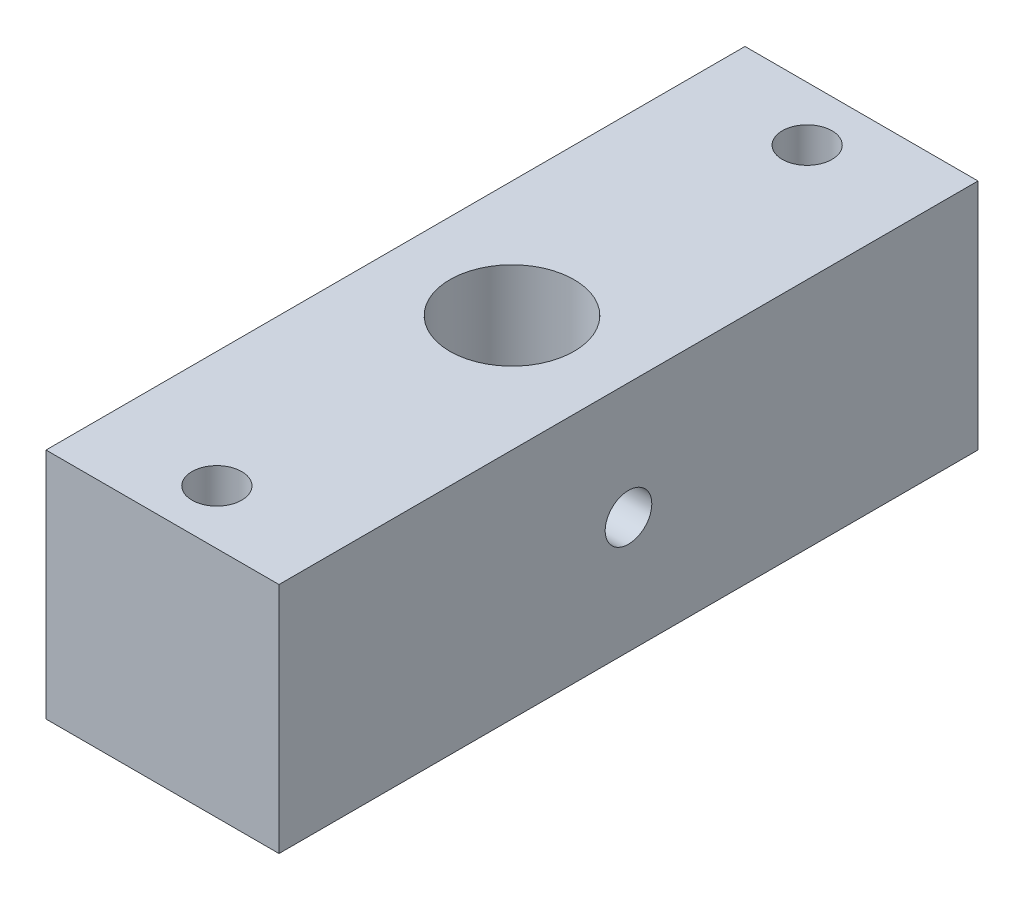
ISO-10303-21;
HEADER;
FILE_DESCRIPTION(('STEP AP214'),'2;1');
FILE_NAME('part.step','',(''),(''),'','','');
FILE_SCHEMA(('AUTOMOTIVE_DESIGN { 1 0 10303 214 1 1 1 1 }'));
ENDSEC;
DATA;
#1=APPLICATION_CONTEXT('core data for automotive mechanical design processes');
#2=APPLICATION_PROTOCOL_DEFINITION('international standard','automotive_design',2000,#1);
#3=PRODUCT_CONTEXT('',#1,'mechanical');
#4=PRODUCT('Part','Part','',(#3));
#5=PRODUCT_RELATED_PRODUCT_CATEGORY('part','',(#4));
#6=PRODUCT_DEFINITION_FORMATION('','',#4);
#7=PRODUCT_DEFINITION_CONTEXT('part definition',#1,'design');
#8=PRODUCT_DEFINITION('design','',#6,#7);
#9=PRODUCT_DEFINITION_SHAPE('','',#8);
#10=(LENGTH_UNIT() NAMED_UNIT(*) SI_UNIT(.MILLI.,.METRE.));
#11=(NAMED_UNIT(*) PLANE_ANGLE_UNIT() SI_UNIT($,.RADIAN.));
#12=(NAMED_UNIT(*) SI_UNIT($,.STERADIAN.) SOLID_ANGLE_UNIT());
#13=UNCERTAINTY_MEASURE_WITH_UNIT(LENGTH_MEASURE(1.E-05),#10,'distance_accuracy_value','');
#14=(GEOMETRIC_REPRESENTATION_CONTEXT(3) GLOBAL_UNCERTAINTY_ASSIGNED_CONTEXT((#13)) GLOBAL_UNIT_ASSIGNED_CONTEXT((#10,
#11,#12)) REPRESENTATION_CONTEXT('',''));
#15=CARTESIAN_POINT('',(0.,0.,0.));
#16=DIRECTION('',(0.,0.,1.));
#17=DIRECTION('',(1.,0.,0.));
#18=AXIS2_PLACEMENT_3D('',#15,#16,#17);
#19=CARTESIAN_POINT('',(0.,7.5,0.));
#20=DIRECTION('',(0.,1.,0.));
#21=DIRECTION('',(0.,0.,1.));
#22=AXIS2_PLACEMENT_3D('',#19,#20,#21);
#23=PLANE('',#22);
#24=CARTESIAN_POINT('',(0.,7.5,-19.));
#25=DIRECTION('',(0.,1.,0.));
#26=DIRECTION('',(0.,0.,1.));
#27=AXIS2_PLACEMENT_3D('',#24,#25,#26);
#28=CIRCLE('',#27,1.6);
#29=CARTESIAN_POINT('',(0.,7.5,-17.4));
#30=VERTEX_POINT('',#29);
#31=EDGE_CURVE('E192',#30,#30,#28,.T.);
#32=ORIENTED_EDGE('',*,*,#31,.F.);
#33=EDGE_LOOP('',(#32));
#34=FACE_BOUND('',#33,.T.);
#35=DIRECTION('',(0.,0.,-1.));
#36=VECTOR('',#35,1.);
#37=CARTESIAN_POINT('',(7.5,7.5,-22.5));
#38=LINE('',#37,#36);
#39=CARTESIAN_POINT('',(7.5,7.5,22.5));
#40=VERTEX_POINT('',#39);
#41=CARTESIAN_POINT('',(7.5,7.5,-22.5));
#42=VERTEX_POINT('',#41);
#43=EDGE_CURVE('E95',#40,#42,#38,.T.);
#44=ORIENTED_EDGE('',*,*,#43,.T.);
#45=DIRECTION('',(-1.,0.,0.));
#46=VECTOR('',#45,1.);
#47=CARTESIAN_POINT('',(-7.5,7.5,-22.5));
#48=LINE('',#47,#46);
#49=CARTESIAN_POINT('',(-7.5,7.5,-22.5));
#50=VERTEX_POINT('',#49);
#51=EDGE_CURVE('E90',#42,#50,#48,.T.);
#52=ORIENTED_EDGE('',*,*,#51,.T.);
#53=DIRECTION('',(0.,0.,1.));
#54=VECTOR('',#53,1.);
#55=CARTESIAN_POINT('',(-7.5,7.5,-22.5));
#56=LINE('',#55,#54);
#57=CARTESIAN_POINT('',(-7.5,7.5,22.5));
#58=VERTEX_POINT('',#57);
#59=EDGE_CURVE('E93',#50,#58,#56,.T.);
#60=ORIENTED_EDGE('',*,*,#59,.T.);
#61=DIRECTION('',(1.,0.,0.));
#62=VECTOR('',#61,1.);
#63=CARTESIAN_POINT('',(-7.5,7.5,22.5));
#64=LINE('',#63,#62);
#65=EDGE_CURVE('E60',#58,#40,#64,.T.);
#66=ORIENTED_EDGE('',*,*,#65,.T.);
#67=EDGE_LOOP('',(#44,#52,#60,#66));
#68=FACE_BOUND('',#67,.T.);
#69=CARTESIAN_POINT('',(0.,7.5,0.));
#70=DIRECTION('',(0.,1.,0.));
#71=DIRECTION('',(0.,0.,1.));
#72=AXIS2_PLACEMENT_3D('',#69,#70,#71);
#73=CIRCLE('',#72,4.);
#74=CARTESIAN_POINT('',(0.,7.5,4.));
#75=VERTEX_POINT('',#74);
#76=EDGE_CURVE('E111',#75,#75,#73,.T.);
#77=ORIENTED_EDGE('',*,*,#76,.F.);
#78=EDGE_LOOP('',(#77));
#79=FACE_BOUND('',#78,.T.);
#80=CARTESIAN_POINT('',(0.,7.5,19.));
#81=DIRECTION('',(0.,1.,0.));
#82=DIRECTION('',(0.,0.,-1.));
#83=AXIS2_PLACEMENT_3D('',#80,#81,#82);
#84=CIRCLE('',#83,1.6);
#85=CARTESIAN_POINT('',(0.,7.5,17.4));
#86=VERTEX_POINT('',#85);
#87=EDGE_CURVE('E185',#86,#86,#84,.T.);
#88=ORIENTED_EDGE('',*,*,#87,.F.);
#89=EDGE_LOOP('',(#88));
#90=FACE_BOUND('',#89,.T.);
#91=ADVANCED_FACE('F36',(#34,#68,#79,#90),#23,.T.);
#92=CARTESIAN_POINT('',(0.,-7.5,0.));
#93=DIRECTION('',(0.,1.,0.));
#94=DIRECTION('',(0.,0.,1.));
#95=AXIS2_PLACEMENT_3D('',#92,#93,#94);
#96=PLANE('',#95);
#97=DIRECTION('',(0.,0.,-1.));
#98=VECTOR('',#97,1.);
#99=CARTESIAN_POINT('',(7.5,-7.5,-22.5));
#100=LINE('',#99,#98);
#101=CARTESIAN_POINT('',(7.5,-7.5,22.5));
#102=VERTEX_POINT('',#101);
#103=CARTESIAN_POINT('',(7.5,-7.5,-22.5));
#104=VERTEX_POINT('',#103);
#105=EDGE_CURVE('E108',#102,#104,#100,.T.);
#106=ORIENTED_EDGE('',*,*,#105,.F.);
#107=DIRECTION('',(1.,0.,0.));
#108=VECTOR('',#107,1.);
#109=CARTESIAN_POINT('',(-7.5,-7.5,22.5));
#110=LINE('',#109,#108);
#111=CARTESIAN_POINT('',(-7.5,-7.5,22.5));
#112=VERTEX_POINT('',#111);
#113=EDGE_CURVE('E83',#112,#102,#110,.T.);
#114=ORIENTED_EDGE('',*,*,#113,.F.);
#115=DIRECTION('',(0.,0.,1.));
#116=VECTOR('',#115,1.);
#117=CARTESIAN_POINT('',(-7.5,-7.5,-22.5));
#118=LINE('',#117,#116);
#119=CARTESIAN_POINT('',(-7.5,-7.5,-22.5));
#120=VERTEX_POINT('',#119);
#121=EDGE_CURVE('E77',#120,#112,#118,.T.);
#122=ORIENTED_EDGE('',*,*,#121,.F.);
#123=DIRECTION('',(-1.,0.,0.));
#124=VECTOR('',#123,1.);
#125=CARTESIAN_POINT('',(-7.5,-7.5,-22.5));
#126=LINE('',#125,#124);
#127=EDGE_CURVE('E99',#104,#120,#126,.T.);
#128=ORIENTED_EDGE('',*,*,#127,.F.);
#129=EDGE_LOOP('',(#106,#114,#122,#128));
#130=FACE_BOUND('',#129,.T.);
#131=CARTESIAN_POINT('',(0.,-7.5,0.));
#132=DIRECTION('',(0.,1.,0.));
#133=DIRECTION('',(0.,0.,1.));
#134=AXIS2_PLACEMENT_3D('',#131,#132,#133);
#135=CIRCLE('',#134,4.);
#136=CARTESIAN_POINT('',(0.,-7.5,4.));
#137=VERTEX_POINT('',#136);
#138=EDGE_CURVE('E176',#137,#137,#135,.T.);
#139=ORIENTED_EDGE('',*,*,#138,.T.);
#140=EDGE_LOOP('',(#139));
#141=FACE_BOUND('',#140,.T.);
#142=CARTESIAN_POINT('',(0.,-7.5,-19.));
#143=DIRECTION('',(0.,1.,0.));
#144=DIRECTION('',(0.,0.,1.));
#145=AXIS2_PLACEMENT_3D('',#142,#143,#144);
#146=CIRCLE('',#145,1.6);
#147=CARTESIAN_POINT('',(0.,-7.5,-17.4));
#148=VERTEX_POINT('',#147);
#149=EDGE_CURVE('E180',#148,#148,#146,.T.);
#150=ORIENTED_EDGE('',*,*,#149,.T.);
#151=EDGE_LOOP('',(#150));
#152=FACE_BOUND('',#151,.T.);
#153=CARTESIAN_POINT('',(0.,-7.5,19.));
#154=DIRECTION('',(0.,1.,0.));
#155=DIRECTION('',(0.,0.,-1.));
#156=AXIS2_PLACEMENT_3D('',#153,#154,#155);
#157=CIRCLE('',#156,1.6);
#158=CARTESIAN_POINT('',(0.,-7.5,17.4));
#159=VERTEX_POINT('',#158);
#160=EDGE_CURVE('E183',#159,#159,#157,.T.);
#161=ORIENTED_EDGE('',*,*,#160,.T.);
#162=EDGE_LOOP('',(#161));
#163=FACE_BOUND('',#162,.T.);
#164=ADVANCED_FACE('F147',(#130,#141,#152,#163),#96,.F.);
#165=CARTESIAN_POINT('',(7.5,7.5,-22.5));
#166=DIRECTION('',(-1.,0.,0.));
#167=DIRECTION('',(0.,0.,1.));
#168=AXIS2_PLACEMENT_3D('',#165,#166,#167);
#169=PLANE('',#168);
#170=CARTESIAN_POINT('',(7.5,0.,0.));
#171=DIRECTION('',(1.,0.,0.));
#172=DIRECTION('',(0.,0.,-1.));
#173=AXIS2_PLACEMENT_3D('',#170,#171,#172);
#174=CIRCLE('',#173,1.5);
#175=CARTESIAN_POINT('',(7.5,0.,-1.5));
#176=VERTEX_POINT('',#175);
#177=EDGE_CURVE('E170',#176,#176,#174,.T.);
#178=ORIENTED_EDGE('',*,*,#177,.F.);
#179=EDGE_LOOP('',(#178));
#180=FACE_BOUND('',#179,.T.);
#181=ORIENTED_EDGE('',*,*,#105,.T.);
#182=DIRECTION('',(0.,-1.,0.));
#183=VECTOR('',#182,1.);
#184=CARTESIAN_POINT('',(7.5,7.5,-22.5));
#185=LINE('',#184,#183);
#186=EDGE_CURVE('E11',#42,#104,#185,.T.);
#187=ORIENTED_EDGE('',*,*,#186,.F.);
#188=ORIENTED_EDGE('',*,*,#43,.F.);
#189=DIRECTION('',(0.,-1.,0.));
#190=VECTOR('',#189,1.);
#191=CARTESIAN_POINT('',(7.5,7.5,22.5));
#192=LINE('',#191,#190);
#193=EDGE_CURVE('E104',#40,#102,#192,.T.);
#194=ORIENTED_EDGE('',*,*,#193,.T.);
#195=EDGE_LOOP('',(#181,#187,#188,#194));
#196=FACE_BOUND('',#195,.T.);
#197=ADVANCED_FACE('F38',(#180,#196),#169,.F.);
#198=CARTESIAN_POINT('',(-7.5,7.5,-22.5));
#199=DIRECTION('',(0.,0.,1.));
#200=DIRECTION('',(1.,0.,0.));
#201=AXIS2_PLACEMENT_3D('',#198,#199,#200);
#202=PLANE('',#201);
#203=ORIENTED_EDGE('',*,*,#127,.T.);
#204=DIRECTION('',(0.,-1.,0.));
#205=VECTOR('',#204,1.);
#206=CARTESIAN_POINT('',(-7.5,7.5,-22.5));
#207=LINE('',#206,#205);
#208=EDGE_CURVE('E51',#50,#120,#207,.T.);
#209=ORIENTED_EDGE('',*,*,#208,.F.);
#210=ORIENTED_EDGE('',*,*,#51,.F.);
#211=ORIENTED_EDGE('',*,*,#186,.T.);
#212=EDGE_LOOP('',(#203,#209,#210,#211));
#213=FACE_BOUND('',#212,.T.);
#214=ADVANCED_FACE('F98',(#213),#202,.F.);
#215=CARTESIAN_POINT('',(-7.5,7.5,-22.5));
#216=DIRECTION('',(1.,0.,0.));
#217=DIRECTION('',(0.,0.,-1.));
#218=AXIS2_PLACEMENT_3D('',#215,#216,#217);
#219=PLANE('',#218);
#220=CARTESIAN_POINT('',(-7.5,0.,0.));
#221=DIRECTION('',(1.,0.,0.));
#222=DIRECTION('',(0.,0.,-1.));
#223=AXIS2_PLACEMENT_3D('',#220,#221,#222);
#224=CIRCLE('',#223,1.5);
#225=CARTESIAN_POINT('',(-7.5,0.,-1.5));
#226=VERTEX_POINT('',#225);
#227=EDGE_CURVE('E121',#226,#226,#224,.T.);
#228=ORIENTED_EDGE('',*,*,#227,.T.);
#229=EDGE_LOOP('',(#228));
#230=FACE_BOUND('',#229,.T.);
#231=ORIENTED_EDGE('',*,*,#121,.T.);
#232=DIRECTION('',(0.,-1.,0.));
#233=VECTOR('',#232,1.);
#234=CARTESIAN_POINT('',(-7.5,7.5,22.5));
#235=LINE('',#234,#233);
#236=EDGE_CURVE('E100',#58,#112,#235,.T.);
#237=ORIENTED_EDGE('',*,*,#236,.F.);
#238=ORIENTED_EDGE('',*,*,#59,.F.);
#239=ORIENTED_EDGE('',*,*,#208,.T.);
#240=EDGE_LOOP('',(#231,#237,#238,#239));
#241=FACE_BOUND('',#240,.T.);
#242=ADVANCED_FACE('F102',(#230,#241),#219,.F.);
#243=CARTESIAN_POINT('',(-7.5,7.5,22.5));
#244=DIRECTION('',(0.,0.,-1.));
#245=DIRECTION('',(-1.,0.,0.));
#246=AXIS2_PLACEMENT_3D('',#243,#244,#245);
#247=PLANE('',#246);
#248=ORIENTED_EDGE('',*,*,#113,.T.);
#249=ORIENTED_EDGE('',*,*,#193,.F.);
#250=ORIENTED_EDGE('',*,*,#65,.F.);
#251=ORIENTED_EDGE('',*,*,#236,.T.);
#252=EDGE_LOOP('',(#248,#249,#250,#251));
#253=FACE_BOUND('',#252,.T.);
#254=ADVANCED_FACE('F142',(#253),#247,.F.);
#255=CARTESIAN_POINT('',(0.,7.5,0.));
#256=DIRECTION('',(0.,-1.,0.));
#257=DIRECTION('',(0.,0.,-1.));
#258=AXIS2_PLACEMENT_3D('',#255,#256,#257);
#259=CYLINDRICAL_SURFACE('',#258,4.);
#260=CARTESIAN_POINT('',(-3.70809924354783,0.,-1.5));
#261=CARTESIAN_POINT('',(-3.70809640633806,0.0810074837207898,-1.50000304106109));
#262=CARTESIAN_POINT('',(-3.71078260240986,0.161994922503636,-1.49341597549487));
#263=CARTESIAN_POINT('',(-3.72116159304967,0.321528082913202,-1.46736187895468));
#264=CARTESIAN_POINT('',(-3.72885423767112,0.400073877595012,-1.44789523373263));
#265=CARTESIAN_POINT('',(-3.748254802809,0.552375371613527,-1.39689657610574));
#266=CARTESIAN_POINT('',(-3.7599530956926,0.626142056651084,-1.36539347266348));
#267=CARTESIAN_POINT('',(-3.78603134206598,0.76737189681884,-1.29131856742698));
#268=CARTESIAN_POINT('',(-3.80041210067323,0.83483315028252,-1.24874344095039));
#269=CARTESIAN_POINT('',(-3.83103574665713,0.964890311622818,-1.15146661374162));
#270=CARTESIAN_POINT('',(-3.84733341923603,1.02712852962939,-1.09630381213306));
#271=CARTESIAN_POINT('',(-3.87949750628547,1.14172281467149,-0.976395839778926));
#272=CARTESIAN_POINT('',(-3.89536382814785,1.19407677374185,-0.911648630256679));
#273=CARTESIAN_POINT('',(-3.92552873936553,1.28913951229561,-0.7716946551776));
#274=CARTESIAN_POINT('',(-3.93975561223506,1.33145947471586,-0.696206947538027));
#275=CARTESIAN_POINT('',(-3.96438007973848,1.40265117252491,-0.538555771965247));
#276=CARTESIAN_POINT('',(-3.97477900217006,1.43152757199197,-0.456394630933535));
#277=CARTESIAN_POINT('',(-3.9901869710344,1.47375789577462,-0.291489341676831));
#278=CARTESIAN_POINT('',(-3.99540915214774,1.48772762744046,-0.208923197281596));
#279=CARTESIAN_POINT('',(-4.0006401410794,1.50172120094499,-0.0424643637947853));
#280=CARTESIAN_POINT('',(-4.00065064414902,1.50174957761871,0.0414278850628338));
#281=CARTESIAN_POINT('',(-3.99559265903894,1.48821823853483,0.203743543064477));
#282=CARTESIAN_POINT('',(-3.99077541996683,1.47533070205119,0.282232178266901));
#283=CARTESIAN_POINT('',(-3.97693274932263,1.43746408477445,0.435839217984392));
#284=CARTESIAN_POINT('',(-3.96790701975578,1.41248414773796,0.510957383430299));
#285=CARTESIAN_POINT('',(-3.94637769167531,1.35082954832415,0.656989017303105));
#286=CARTESIAN_POINT('',(-3.93382539470077,1.31398999473159,0.72782539228731));
#287=CARTESIAN_POINT('',(-3.90651310225279,1.22980790307061,0.86248660795756));
#288=CARTESIAN_POINT('',(-3.8917523951284,1.1824619769824,0.926309176932323));
#289=CARTESIAN_POINT('',(-3.86052529655816,1.07537271371681,1.04909048680094));
#290=CARTESIAN_POINT('',(-3.84400963763883,1.01506608434957,1.10754614526348));
#291=CARTESIAN_POINT('',(-3.81182460645722,0.88540700667844,1.21370395569342));
#292=CARTESIAN_POINT('',(-3.79615544748847,0.81605229341336,1.261403406929));
#293=CARTESIAN_POINT('',(-3.76712703500335,0.668280532537176,1.34565611808152));
#294=CARTESIAN_POINT('',(-3.75382677150277,0.589696506313932,1.38193847851831));
#295=CARTESIAN_POINT('',(-3.73172438629003,0.426903774832426,1.44056464441501));
#296=CARTESIAN_POINT('',(-3.72291976205783,0.342698228406309,1.46291620605595));
#297=CARTESIAN_POINT('',(-3.71139597222848,0.176024037684046,1.49190191709668));
#298=CARTESIAN_POINT('',(-3.70836785241537,0.0937158944638582,1.49933521158966));
#299=CARTESIAN_POINT('',(-3.70786539525016,-0.0710093567417431,1.50057885636272));
#300=CARTESIAN_POINT('',(-3.71038967003987,-0.153426432352471,1.49439261093762));
#301=CARTESIAN_POINT('',(-3.72039381629735,-0.311929922287681,1.46929733520157));
#302=CARTESIAN_POINT('',(-3.72763276216449,-0.388131135764661,1.45100618334225));
#303=CARTESIAN_POINT('',(-3.74596487046362,-0.536347944720194,1.40299774640637));
#304=CARTESIAN_POINT('',(-3.75705882250173,-0.608362679168135,1.37327812034623));
#305=CARTESIAN_POINT('',(-3.7823624311608,-0.749164438076206,1.30200292275278));
#306=CARTESIAN_POINT('',(-3.79667328892065,-0.817729292137339,1.26004545177047));
#307=CARTESIAN_POINT('',(-3.82662814294291,-0.94712898172604,1.16591317862479));
#308=CARTESIAN_POINT('',(-3.84227262594077,-1.00796097462463,1.11373463696435));
#309=CARTESIAN_POINT('',(-3.87433046553184,-1.1241683731951,0.996727340900938));
#310=CARTESIAN_POINT('',(-3.89072969357028,-1.17895340876875,0.931306341491062));
#311=CARTESIAN_POINT('',(-3.92149874963302,-1.27683836758944,0.791797471753151));
#312=CARTESIAN_POINT('',(-3.93586857107664,-1.31993825294584,0.717709573322673));
#313=CARTESIAN_POINT('',(-3.96094985704552,-1.39294605619961,0.563016329468476));
#314=CARTESIAN_POINT('',(-3.9716738133801,-1.4228991237926,0.482434433064626));
#315=CARTESIAN_POINT('',(-3.98829436712571,-1.46865641384992,0.316881887523255));
#316=CARTESIAN_POINT('',(-3.99419323299413,-1.4844672854224,0.231913320723593));
#317=CARTESIAN_POINT('',(-4.00028407317073,-1.50077440275483,0.0653355852738157));
#318=CARTESIAN_POINT('',(-4.00078860953764,-1.50210948305899,-0.016180768060845));
#319=CARTESIAN_POINT('',(-3.99684889809224,-1.49158484055461,-0.178226786412423));
#320=CARTESIAN_POINT('',(-3.9924052471313,-1.47972670911414,-0.258756569245257));
#321=CARTESIAN_POINT('',(-3.97921089603771,-1.44374114850638,-0.414548248377126));
#322=CARTESIAN_POINT('',(-3.97056791378017,-1.41992009412164,-0.489890731068834));
#323=CARTESIAN_POINT('',(-3.9498778362099,-1.36098998661564,-0.63551547300639));
#324=CARTESIAN_POINT('',(-3.93783009655664,-1.32587879669525,-0.705796771275543));
#325=CARTESIAN_POINT('',(-3.91090618300074,-1.24368605649519,-0.842540176994413));
#326=CARTESIAN_POINT('',(-3.89593240108828,-1.19616335948585,-0.90871754884685));
#327=CARTESIAN_POINT('',(-3.86499507694844,-1.09119216981239,-1.03241734752336));
#328=CARTESIAN_POINT('',(-3.84903118274027,-1.03374013419213,-1.0899366712559));
#329=CARTESIAN_POINT('',(-3.81688129739175,-0.90693586835494,-1.19781214236196));
#330=CARTESIAN_POINT('',(-3.8007280534916,-0.837115597845689,-1.24762999816025));
#331=CARTESIAN_POINT('',(-3.77098325003638,-0.689584130426675,-1.33484709556843));
#332=CARTESIAN_POINT('',(-3.75739195631216,-0.611872115946519,-1.37224504878157));
#333=CARTESIAN_POINT('',(-3.73402269853266,-0.447044319024594,-1.4346588697426));
#334=CARTESIAN_POINT('',(-3.7244380329086,-0.359665633488215,-1.45906002899523));
#335=CARTESIAN_POINT('',(-3.71147994336315,-0.181514728044213,-1.49172356722079));
#336=CARTESIAN_POINT('',(-3.70810242179736,-0.0907447872900076,-1.49999659339571));
#337=CARTESIAN_POINT('',(-3.70809924354783,0.,-1.5));
#338=B_SPLINE_CURVE_WITH_KNOTS('',3,(#260,#261,#262,#263,#264,#265,#266,#267,#268,#269,#270,
#271,#272,#273,#274,#275,#276,#277,#278,#279,#280,#281,#282,#283,#284,#285,#286,#287,#288,#289,
#290,#291,#292,#293,#294,#295,#296,#297,#298,#299,#300,#301,#302,#303,#304,#305,#306,#307,#308,
#309,#310,#311,#312,#313,#314,#315,#316,#317,#318,#319,#320,#321,#322,#323,#324,#325,#326,#327,
#328,#329,#330,#331,#332,#333,#334,#335,#336,#337),.UNSPECIFIED.,.T.,.F.,(4,2,2,2,2,2,2,2,2,2,2,
2,2,2,2,2,2,2,2,2,2,2,2,2,2,2,2,2,2,2,2,2,2,2,2,2,2,2,4),(0.,0.24268454141617,0.485361814598854,
0.72745985675703,0.969630679682933,1.22274652401128,1.47591628822983,1.73770072136421,
1.9993942638133,2.24980018489679,2.50012465404857,2.73806472803194,2.97602165263335,
3.21744131210668,3.45893893628976,3.71456675065875,3.97025867827335,4.23162592252966,
4.49284751635474,4.73965657740485,4.98640395388884,5.22143845928199,5.45652113429526,
5.70041561005821,5.94439948466355,6.20385016993624,6.46330169650178,6.72185508890168,
6.98028685560127,7.22365720549936,7.4669982031948,7.7044027400389,7.94185223512831,
8.18928323676987,8.43680270894964,8.69738599542079,8.95799630544242,9.23003178870926,
9.50188762323053),.UNSPECIFIED.);
#339=CARTESIAN_POINT('',(-3.70809924354783,0.,-1.5));
#340=VERTEX_POINT('',#339);
#341=EDGE_CURVE('E40',#340,#340,#338,.T.);
#342=ORIENTED_EDGE('',*,*,#341,.F.);
#343=EDGE_LOOP('',(#342));
#344=FACE_BOUND('',#343,.T.);
#345=CARTESIAN_POINT('',(3.70809924354783,0.,-1.5));
#346=CARTESIAN_POINT('',(3.70809640633806,-0.0810074837207898,-1.50000304106109));
#347=CARTESIAN_POINT('',(3.71078260240986,-0.161994922503636,-1.49341597549487));
#348=CARTESIAN_POINT('',(3.72116159304967,-0.321528082913202,-1.46736187895468));
#349=CARTESIAN_POINT('',(3.72885423767112,-0.400073877595012,-1.44789523373263));
#350=CARTESIAN_POINT('',(3.748254802809,-0.552375371613527,-1.39689657610574));
#351=CARTESIAN_POINT('',(3.7599530956926,-0.626142056651084,-1.36539347266348));
#352=CARTESIAN_POINT('',(3.78603134206598,-0.76737189681884,-1.29131856742698));
#353=CARTESIAN_POINT('',(3.80041210067323,-0.83483315028252,-1.24874344095039));
#354=CARTESIAN_POINT('',(3.83103574665713,-0.964890311622818,-1.15146661374162));
#355=CARTESIAN_POINT('',(3.84733341923603,-1.02712852962939,-1.09630381213306));
#356=CARTESIAN_POINT('',(3.87949750628547,-1.14172281467149,-0.976395839778926));
#357=CARTESIAN_POINT('',(3.89536382814785,-1.19407677374185,-0.911648630256679));
#358=CARTESIAN_POINT('',(3.92552873936553,-1.28913951229561,-0.7716946551776));
#359=CARTESIAN_POINT('',(3.93975561223505,-1.33145947471586,-0.696206947538027));
#360=CARTESIAN_POINT('',(3.96438007973847,-1.40265117252491,-0.538555771965247));
#361=CARTESIAN_POINT('',(3.97477900217006,-1.43152757199197,-0.456394630933535));
#362=CARTESIAN_POINT('',(3.99018697103439,-1.47375789577462,-0.291489341676831));
#363=CARTESIAN_POINT('',(3.99540915214774,-1.48772762744046,-0.208923197281596));
#364=CARTESIAN_POINT('',(4.0006401410794,-1.50172120094499,-0.0424643637947853));
#365=CARTESIAN_POINT('',(4.00065064414902,-1.50174957761871,0.0414278850628338));
#366=CARTESIAN_POINT('',(3.99559265903894,-1.48821823853483,0.203743543064477));
#367=CARTESIAN_POINT('',(3.99077541996683,-1.47533070205119,0.282232178266901));
#368=CARTESIAN_POINT('',(3.97693274932263,-1.43746408477445,0.435839217984392));
#369=CARTESIAN_POINT('',(3.96790701975577,-1.41248414773796,0.510957383430299));
#370=CARTESIAN_POINT('',(3.9463776916753,-1.35082954832415,0.656989017303105));
#371=CARTESIAN_POINT('',(3.93382539470077,-1.31398999473159,0.72782539228731));
#372=CARTESIAN_POINT('',(3.90651310225279,-1.22980790307061,0.86248660795756));
#373=CARTESIAN_POINT('',(3.8917523951284,-1.1824619769824,0.926309176932323));
#374=CARTESIAN_POINT('',(3.86052529655816,-1.07537271371681,1.04909048680094));
#375=CARTESIAN_POINT('',(3.84400963763883,-1.01506608434957,1.10754614526348));
#376=CARTESIAN_POINT('',(3.81182460645722,-0.88540700667844,1.21370395569342));
#377=CARTESIAN_POINT('',(3.79615544748847,-0.81605229341336,1.261403406929));
#378=CARTESIAN_POINT('',(3.76712703500335,-0.668280532537176,1.34565611808152));
#379=CARTESIAN_POINT('',(3.75382677150277,-0.589696506313932,1.38193847851831));
#380=CARTESIAN_POINT('',(3.73172438629002,-0.426903774832426,1.44056464441501));
#381=CARTESIAN_POINT('',(3.72291976205783,-0.342698228406309,1.46291620605595));
#382=CARTESIAN_POINT('',(3.71139597222848,-0.176024037684046,1.49190191709668));
#383=CARTESIAN_POINT('',(3.70836785241537,-0.0937158944638582,1.49933521158966));
#384=CARTESIAN_POINT('',(3.70786539525016,0.0710093567417431,1.50057885636272));
#385=CARTESIAN_POINT('',(3.71038967003986,0.153426432352471,1.49439261093762));
#386=CARTESIAN_POINT('',(3.72039381629735,0.311929922287681,1.46929733520157));
#387=CARTESIAN_POINT('',(3.72763276216449,0.388131135764661,1.45100618334225));
#388=CARTESIAN_POINT('',(3.74596487046361,0.536347944720194,1.40299774640637));
#389=CARTESIAN_POINT('',(3.75705882250172,0.608362679168135,1.37327812034623));
#390=CARTESIAN_POINT('',(3.7823624311608,0.749164438076206,1.30200292275278));
#391=CARTESIAN_POINT('',(3.79667328892065,0.817729292137339,1.26004545177047));
#392=CARTESIAN_POINT('',(3.82662814294291,0.94712898172604,1.16591317862479));
#393=CARTESIAN_POINT('',(3.84227262594077,1.00796097462463,1.11373463696435));
#394=CARTESIAN_POINT('',(3.87433046553184,1.1241683731951,0.996727340900938));
#395=CARTESIAN_POINT('',(3.89072969357027,1.17895340876875,0.931306341491062));
#396=CARTESIAN_POINT('',(3.92149874963302,1.27683836758944,0.791797471753151));
#397=CARTESIAN_POINT('',(3.93586857107664,1.31993825294584,0.717709573322673));
#398=CARTESIAN_POINT('',(3.96094985704552,1.39294605619961,0.563016329468476));
#399=CARTESIAN_POINT('',(3.9716738133801,1.4228991237926,0.482434433064626));
#400=CARTESIAN_POINT('',(3.98829436712571,1.46865641384992,0.316881887523255));
#401=CARTESIAN_POINT('',(3.99419323299412,1.4844672854224,0.231913320723593));
#402=CARTESIAN_POINT('',(4.00028407317073,1.50077440275483,0.0653355852738157));
#403=CARTESIAN_POINT('',(4.00078860953764,1.50210948305899,-0.016180768060845));
#404=CARTESIAN_POINT('',(3.99684889809223,1.49158484055461,-0.178226786412423));
#405=CARTESIAN_POINT('',(3.9924052471313,1.47972670911414,-0.258756569245257));
#406=CARTESIAN_POINT('',(3.97921089603771,1.44374114850638,-0.414548248377126));
#407=CARTESIAN_POINT('',(3.97056791378017,1.41992009412164,-0.489890731068834));
#408=CARTESIAN_POINT('',(3.9498778362099,1.36098998661564,-0.63551547300639));
#409=CARTESIAN_POINT('',(3.93783009655664,1.32587879669525,-0.705796771275543));
#410=CARTESIAN_POINT('',(3.91090618300074,1.24368605649519,-0.842540176994413));
#411=CARTESIAN_POINT('',(3.89593240108828,1.19616335948585,-0.90871754884685));
#412=CARTESIAN_POINT('',(3.86499507694844,1.09119216981239,-1.03241734752336));
#413=CARTESIAN_POINT('',(3.84903118274027,1.03374013419213,-1.0899366712559));
#414=CARTESIAN_POINT('',(3.81688129739175,0.90693586835494,-1.19781214236196));
#415=CARTESIAN_POINT('',(3.8007280534916,0.837115597845689,-1.24762999816025));
#416=CARTESIAN_POINT('',(3.77098325003638,0.689584130426675,-1.33484709556843));
#417=CARTESIAN_POINT('',(3.75739195631216,0.611872115946519,-1.37224504878157));
#418=CARTESIAN_POINT('',(3.73402269853266,0.447044319024594,-1.4346588697426));
#419=CARTESIAN_POINT('',(3.7244380329086,0.359665633488215,-1.45906002899523));
#420=CARTESIAN_POINT('',(3.71147994336315,0.181514728044213,-1.49172356722079));
#421=CARTESIAN_POINT('',(3.70810242179736,0.0907447872900076,-1.49999659339571));
#422=CARTESIAN_POINT('',(3.70809924354783,0.,-1.5));
#423=B_SPLINE_CURVE_WITH_KNOTS('',3,(#345,#346,#347,#348,#349,#350,#351,#352,#353,#354,#355,
#356,#357,#358,#359,#360,#361,#362,#363,#364,#365,#366,#367,#368,#369,#370,#371,#372,#373,#374,
#375,#376,#377,#378,#379,#380,#381,#382,#383,#384,#385,#386,#387,#388,#389,#390,#391,#392,#393,
#394,#395,#396,#397,#398,#399,#400,#401,#402,#403,#404,#405,#406,#407,#408,#409,#410,#411,#412,
#413,#414,#415,#416,#417,#418,#419,#420,#421,#422),.UNSPECIFIED.,.T.,.F.,(4,2,2,2,2,2,2,2,2,2,2,
2,2,2,2,2,2,2,2,2,2,2,2,2,2,2,2,2,2,2,2,2,2,2,2,2,2,2,4),(0.,0.24268454141617,0.485361814598854,
0.72745985675703,0.969630679682933,1.22274652401128,1.47591628822983,1.73770072136421,
1.9993942638133,2.24980018489679,2.50012465404857,2.73806472803194,2.97602165263335,
3.21744131210668,3.45893893628976,3.71456675065875,3.97025867827335,4.23162592252966,
4.49284751635474,4.73965657740485,4.98640395388884,5.22143845928199,5.45652113429526,
5.70041561005821,5.94439948466355,6.20385016993624,6.46330169650178,6.72185508890168,
6.98028685560127,7.22365720549936,7.4669982031948,7.7044027400389,7.94185223512831,
8.18928323676987,8.43680270894964,8.69738599542079,8.95799630544242,9.23003178870926,
9.50188762323053),.UNSPECIFIED.);
#424=CARTESIAN_POINT('',(3.70809924354783,0.,-1.5));
#425=VERTEX_POINT('',#424);
#426=EDGE_CURVE('E116',#425,#425,#423,.T.);
#427=ORIENTED_EDGE('',*,*,#426,.F.);
#428=EDGE_LOOP('',(#427));
#429=FACE_BOUND('',#428,.T.);
#430=ORIENTED_EDGE('',*,*,#76,.T.);
#431=EDGE_LOOP('',(#430));
#432=FACE_BOUND('',#431,.T.);
#433=ORIENTED_EDGE('',*,*,#138,.F.);
#434=EDGE_LOOP('',(#433));
#435=FACE_BOUND('',#434,.T.);
#436=ADVANCED_FACE('F122',(#344,#429,#432,#435),#259,.F.);
#437=CARTESIAN_POINT('',(0.,7.5,-19.));
#438=DIRECTION('',(0.,-1.,0.));
#439=DIRECTION('',(0.,0.,-1.));
#440=AXIS2_PLACEMENT_3D('',#437,#438,#439);
#441=CYLINDRICAL_SURFACE('',#440,1.6);
#442=ORIENTED_EDGE('',*,*,#31,.T.);
#443=EDGE_LOOP('',(#442));
#444=FACE_BOUND('',#443,.T.);
#445=ORIENTED_EDGE('',*,*,#149,.F.);
#446=EDGE_LOOP('',(#445));
#447=FACE_BOUND('',#446,.T.);
#448=ADVANCED_FACE('F135',(#444,#447),#441,.F.);
#449=CARTESIAN_POINT('',(0.,7.5,19.));
#450=DIRECTION('',(0.,-1.,0.));
#451=DIRECTION('',(0.,0.,-1.));
#452=AXIS2_PLACEMENT_3D('',#449,#450,#451);
#453=CYLINDRICAL_SURFACE('',#452,1.6);
#454=ORIENTED_EDGE('',*,*,#87,.T.);
#455=EDGE_LOOP('',(#454));
#456=FACE_BOUND('',#455,.T.);
#457=ORIENTED_EDGE('',*,*,#160,.F.);
#458=EDGE_LOOP('',(#457));
#459=FACE_BOUND('',#458,.T.);
#460=ADVANCED_FACE('F131',(#456,#459),#453,.F.);
#461=CARTESIAN_POINT('',(-7.5,0.,0.));
#462=DIRECTION('',(1.,0.,0.));
#463=DIRECTION('',(0.,0.,-1.));
#464=AXIS2_PLACEMENT_3D('',#461,#462,#463);
#465=CYLINDRICAL_SURFACE('',#464,1.5);
#466=ORIENTED_EDGE('',*,*,#426,.T.);
#467=EDGE_LOOP('',(#466));
#468=FACE_BOUND('',#467,.T.);
#469=ORIENTED_EDGE('',*,*,#177,.T.);
#470=EDGE_LOOP('',(#469));
#471=FACE_BOUND('',#470,.T.);
#472=ADVANCED_FACE('F126',(#468,#471),#465,.F.);
#473=ORIENTED_EDGE('',*,*,#341,.T.);
#474=EDGE_LOOP('',(#473));
#475=FACE_BOUND('',#474,.T.);
#476=ORIENTED_EDGE('',*,*,#227,.F.);
#477=EDGE_LOOP('',(#476));
#478=FACE_BOUND('',#477,.T.);
#479=ADVANCED_FACE('F130',(#475,#478),#465,.F.);
#480=CLOSED_SHELL('',(#91,#164,#197,#214,#242,#254,#436,#448,#460,#472,#479));
#481=MANIFOLD_SOLID_BREP('B2',#480);
#482=ADVANCED_BREP_SHAPE_REPRESENTATION('',(#18,#481),#14);
#483=SHAPE_DEFINITION_REPRESENTATION(#9,#482);
ENDSEC;
END-ISO-10303-21;
